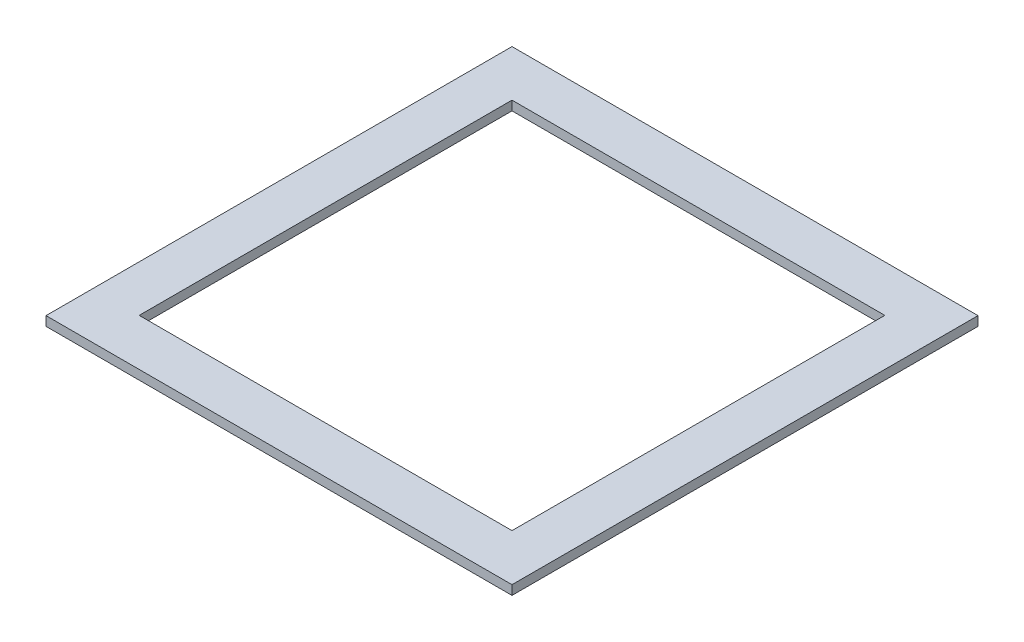
ISO-10303-21;
HEADER;
FILE_DESCRIPTION(('STEP AP214'),'2;1');
FILE_NAME('part.step','',(''),(''),'','','');
FILE_SCHEMA(('AUTOMOTIVE_DESIGN { 1 0 10303 214 1 1 1 1 }'));
ENDSEC;
DATA;
#1=APPLICATION_CONTEXT('core data for automotive mechanical design processes');
#2=APPLICATION_PROTOCOL_DEFINITION('international standard','automotive_design',2000,#1);
#3=PRODUCT_CONTEXT('',#1,'mechanical');
#4=PRODUCT('Part','Part','',(#3));
#5=PRODUCT_RELATED_PRODUCT_CATEGORY('part','',(#4));
#6=PRODUCT_DEFINITION_FORMATION('','',#4);
#7=PRODUCT_DEFINITION_CONTEXT('part definition',#1,'design');
#8=PRODUCT_DEFINITION('design','',#6,#7);
#9=PRODUCT_DEFINITION_SHAPE('','',#8);
#10=(LENGTH_UNIT() NAMED_UNIT(*) SI_UNIT(.MILLI.,.METRE.));
#11=(NAMED_UNIT(*) PLANE_ANGLE_UNIT() SI_UNIT($,.RADIAN.));
#12=(NAMED_UNIT(*) SI_UNIT($,.STERADIAN.) SOLID_ANGLE_UNIT());
#13=UNCERTAINTY_MEASURE_WITH_UNIT(LENGTH_MEASURE(1.E-05),#10,'distance_accuracy_value','');
#14=(GEOMETRIC_REPRESENTATION_CONTEXT(3) GLOBAL_UNCERTAINTY_ASSIGNED_CONTEXT((#13)) GLOBAL_UNIT_ASSIGNED_CONTEXT((#10,
#11,#12)) REPRESENTATION_CONTEXT('',''));
#15=CARTESIAN_POINT('',(0.,0.,0.));
#16=DIRECTION('',(0.,0.,1.));
#17=DIRECTION('',(1.,0.,0.));
#18=AXIS2_PLACEMENT_3D('',#15,#16,#17);
#19=CARTESIAN_POINT('',(0.,2.,0.));
#20=DIRECTION('',(0.,0.,-1.));
#21=DIRECTION('',(-1.,0.,0.));
#22=AXIS2_PLACEMENT_3D('',#19,#20,#21);
#23=PLANE('',#22);
#24=DIRECTION('',(1.,0.,0.));
#25=VECTOR('',#24,1.);
#26=CARTESIAN_POINT('',(0.,0.,0.));
#27=LINE('',#26,#25);
#28=CARTESIAN_POINT('',(0.,0.,0.));
#29=VERTEX_POINT('',#28);
#30=CARTESIAN_POINT('',(100.,0.,0.));
#31=VERTEX_POINT('',#30);
#32=EDGE_CURVE('E143',#29,#31,#27,.T.);
#33=ORIENTED_EDGE('',*,*,#32,.T.);
#34=DIRECTION('',(0.,-1.,0.));
#35=VECTOR('',#34,1.);
#36=CARTESIAN_POINT('',(100.,2.,0.));
#37=LINE('',#36,#35);
#38=CARTESIAN_POINT('',(100.,2.,0.));
#39=VERTEX_POINT('',#38);
#40=EDGE_CURVE('E11',#39,#31,#37,.T.);
#41=ORIENTED_EDGE('',*,*,#40,.F.);
#42=DIRECTION('',(1.,0.,0.));
#43=VECTOR('',#42,1.);
#44=CARTESIAN_POINT('',(0.,2.,0.));
#45=LINE('',#44,#43);
#46=CARTESIAN_POINT('',(0.,2.,0.));
#47=VERTEX_POINT('',#46);
#48=EDGE_CURVE('E114',#47,#39,#45,.T.);
#49=ORIENTED_EDGE('',*,*,#48,.F.);
#50=DIRECTION('',(0.,-1.,0.));
#51=VECTOR('',#50,1.);
#52=CARTESIAN_POINT('',(0.,2.,0.));
#53=LINE('',#52,#51);
#54=EDGE_CURVE('E54',#47,#29,#53,.T.);
#55=ORIENTED_EDGE('',*,*,#54,.T.);
#56=EDGE_LOOP('',(#33,#41,#49,#55));
#57=FACE_BOUND('',#56,.T.);
#58=ADVANCED_FACE('F35',(#57),#23,.F.);
#59=CARTESIAN_POINT('',(100.,2.,0.));
#60=DIRECTION('',(-1.,0.,0.));
#61=DIRECTION('',(0.,0.,1.));
#62=AXIS2_PLACEMENT_3D('',#59,#60,#61);
#63=PLANE('',#62);
#64=DIRECTION('',(0.,0.,-1.));
#65=VECTOR('',#64,1.);
#66=CARTESIAN_POINT('',(100.,0.,0.));
#67=LINE('',#66,#65);
#68=CARTESIAN_POINT('',(100.,0.,-100.));
#69=VERTEX_POINT('',#68);
#70=EDGE_CURVE('E120',#31,#69,#67,.T.);
#71=ORIENTED_EDGE('',*,*,#70,.T.);
#72=DIRECTION('',(0.,-1.,0.));
#73=VECTOR('',#72,1.);
#74=CARTESIAN_POINT('',(100.,2.,-100.));
#75=LINE('',#74,#73);
#76=CARTESIAN_POINT('',(100.,2.,-100.));
#77=VERTEX_POINT('',#76);
#78=EDGE_CURVE('E45',#77,#69,#75,.T.);
#79=ORIENTED_EDGE('',*,*,#78,.F.);
#80=DIRECTION('',(0.,0.,-1.));
#81=VECTOR('',#80,1.);
#82=CARTESIAN_POINT('',(100.,2.,0.));
#83=LINE('',#82,#81);
#84=EDGE_CURVE('E108',#39,#77,#83,.T.);
#85=ORIENTED_EDGE('',*,*,#84,.F.);
#86=ORIENTED_EDGE('',*,*,#40,.T.);
#87=EDGE_LOOP('',(#71,#79,#85,#86));
#88=FACE_BOUND('',#87,.T.);
#89=ADVANCED_FACE('F119',(#88),#63,.F.);
#90=CARTESIAN_POINT('',(0.,2.,-100.));
#91=DIRECTION('',(0.,0.,-1.));
#92=DIRECTION('',(-1.,0.,0.));
#93=AXIS2_PLACEMENT_3D('',#90,#91,#92);
#94=PLANE('',#93);
#95=DIRECTION('',(1.,0.,0.));
#96=VECTOR('',#95,1.);
#97=CARTESIAN_POINT('',(0.,0.,-100.));
#98=LINE('',#97,#96);
#99=CARTESIAN_POINT('',(0.,0.,-100.));
#100=VERTEX_POINT('',#99);
#101=EDGE_CURVE('E146',#100,#69,#98,.T.);
#102=ORIENTED_EDGE('',*,*,#101,.F.);
#103=DIRECTION('',(0.,-1.,0.));
#104=VECTOR('',#103,1.);
#105=CARTESIAN_POINT('',(0.,2.,-100.));
#106=LINE('',#105,#104);
#107=CARTESIAN_POINT('',(0.,2.,-100.));
#108=VERTEX_POINT('',#107);
#109=EDGE_CURVE('E80',#108,#100,#106,.T.);
#110=ORIENTED_EDGE('',*,*,#109,.F.);
#111=DIRECTION('',(1.,0.,0.));
#112=VECTOR('',#111,1.);
#113=CARTESIAN_POINT('',(0.,2.,-100.));
#114=LINE('',#113,#112);
#115=EDGE_CURVE('E113',#108,#77,#114,.T.);
#116=ORIENTED_EDGE('',*,*,#115,.T.);
#117=ORIENTED_EDGE('',*,*,#78,.T.);
#118=EDGE_LOOP('',(#102,#110,#116,#117));
#119=FACE_BOUND('',#118,.T.);
#120=ADVANCED_FACE('F124',(#119),#94,.T.);
#121=CARTESIAN_POINT('',(0.,2.,-90.0468668693287));
#122=DIRECTION('',(0.,0.,1.));
#123=DIRECTION('',(1.,0.,0.));
#124=AXIS2_PLACEMENT_3D('',#121,#122,#123);
#125=PLANE('',#124);
#126=DIRECTION('',(-1.,0.,0.));
#127=VECTOR('',#126,1.);
#128=CARTESIAN_POINT('',(0.,0.,-90.0468668693287));
#129=LINE('',#128,#127);
#130=CARTESIAN_POINT('',(89.9531331306713,0.,-90.0468668693287));
#131=VERTEX_POINT('',#130);
#132=CARTESIAN_POINT('',(9.95313313067135,0.,-90.0468668693287));
#133=VERTEX_POINT('',#132);
#134=EDGE_CURVE('E131',#131,#133,#129,.T.);
#135=ORIENTED_EDGE('',*,*,#134,.F.);
#136=DIRECTION('',(0.,-1.,0.));
#137=VECTOR('',#136,1.);
#138=CARTESIAN_POINT('',(89.9531331306713,2.,-90.0468668693287));
#139=LINE('',#138,#137);
#140=CARTESIAN_POINT('',(89.9531331306713,2.,-90.0468668693287));
#141=VERTEX_POINT('',#140);
#142=EDGE_CURVE('E39',#141,#131,#139,.T.);
#143=ORIENTED_EDGE('',*,*,#142,.F.);
#144=DIRECTION('',(-1.,0.,0.));
#145=VECTOR('',#144,1.);
#146=CARTESIAN_POINT('',(0.,2.,-90.0468668693287));
#147=LINE('',#146,#145);
#148=CARTESIAN_POINT('',(9.95313313067135,2.,-90.0468668693287));
#149=VERTEX_POINT('',#148);
#150=EDGE_CURVE('E151',#141,#149,#147,.T.);
#151=ORIENTED_EDGE('',*,*,#150,.T.);
#152=DIRECTION('',(0.,-1.,0.));
#153=VECTOR('',#152,1.);
#154=CARTESIAN_POINT('',(9.95313313067135,2.,-90.0468668693287));
#155=LINE('',#154,#153);
#156=EDGE_CURVE('E127',#149,#133,#155,.T.);
#157=ORIENTED_EDGE('',*,*,#156,.T.);
#158=EDGE_LOOP('',(#135,#143,#151,#157));
#159=FACE_BOUND('',#158,.T.);
#160=ADVANCED_FACE('F37',(#159),#125,.T.);
#161=CARTESIAN_POINT('',(89.9531331306713,2.,0.));
#162=DIRECTION('',(-1.,0.,0.));
#163=DIRECTION('',(0.,0.,1.));
#164=AXIS2_PLACEMENT_3D('',#161,#162,#163);
#165=PLANE('',#164);
#166=DIRECTION('',(0.,0.,-1.));
#167=VECTOR('',#166,1.);
#168=CARTESIAN_POINT('',(89.9531331306713,0.,0.));
#169=LINE('',#168,#167);
#170=CARTESIAN_POINT('',(89.9531331306713,0.,-10.0468668693287));
#171=VERTEX_POINT('',#170);
#172=EDGE_CURVE('E134',#171,#131,#169,.T.);
#173=ORIENTED_EDGE('',*,*,#172,.F.);
#174=DIRECTION('',(0.,-1.,0.));
#175=VECTOR('',#174,1.);
#176=CARTESIAN_POINT('',(89.9531331306713,2.,-10.0468668693287));
#177=LINE('',#176,#175);
#178=CARTESIAN_POINT('',(89.9531331306713,2.,-10.0468668693287));
#179=VERTEX_POINT('',#178);
#180=EDGE_CURVE('E156',#179,#171,#177,.T.);
#181=ORIENTED_EDGE('',*,*,#180,.F.);
#182=DIRECTION('',(0.,0.,-1.));
#183=VECTOR('',#182,1.);
#184=CARTESIAN_POINT('',(89.9531331306713,2.,0.));
#185=LINE('',#184,#183);
#186=EDGE_CURVE('E165',#179,#141,#185,.T.);
#187=ORIENTED_EDGE('',*,*,#186,.T.);
#188=ORIENTED_EDGE('',*,*,#142,.T.);
#189=EDGE_LOOP('',(#173,#181,#187,#188));
#190=FACE_BOUND('',#189,.T.);
#191=ADVANCED_FACE('F163',(#190),#165,.T.);
#192=CARTESIAN_POINT('',(0.,2.,-10.0468668693287));
#193=DIRECTION('',(0.,0.,-1.));
#194=DIRECTION('',(-1.,0.,0.));
#195=AXIS2_PLACEMENT_3D('',#192,#193,#194);
#196=PLANE('',#195);
#197=DIRECTION('',(1.,0.,0.));
#198=VECTOR('',#197,1.);
#199=CARTESIAN_POINT('',(0.,0.,-10.0468668693287));
#200=LINE('',#199,#198);
#201=CARTESIAN_POINT('',(9.95313313067136,0.,-10.0468668693287));
#202=VERTEX_POINT('',#201);
#203=EDGE_CURVE('E137',#202,#171,#200,.T.);
#204=ORIENTED_EDGE('',*,*,#203,.F.);
#205=DIRECTION('',(0.,-1.,0.));
#206=VECTOR('',#205,1.);
#207=CARTESIAN_POINT('',(9.95313313067136,2.,-10.0468668693287));
#208=LINE('',#207,#206);
#209=CARTESIAN_POINT('',(9.95313313067136,2.,-10.0468668693287));
#210=VERTEX_POINT('',#209);
#211=EDGE_CURVE('E155',#210,#202,#208,.T.);
#212=ORIENTED_EDGE('',*,*,#211,.F.);
#213=DIRECTION('',(1.,0.,0.));
#214=VECTOR('',#213,1.);
#215=CARTESIAN_POINT('',(0.,2.,-10.0468668693287));
#216=LINE('',#215,#214);
#217=EDGE_CURVE('E172',#210,#179,#216,.T.);
#218=ORIENTED_EDGE('',*,*,#217,.T.);
#219=ORIENTED_EDGE('',*,*,#180,.T.);
#220=EDGE_LOOP('',(#204,#212,#218,#219));
#221=FACE_BOUND('',#220,.T.);
#222=ADVANCED_FACE('F170',(#221),#196,.T.);
#223=CARTESIAN_POINT('',(9.95313313067136,2.,0.));
#224=DIRECTION('',(1.,0.,0.));
#225=DIRECTION('',(0.,0.,-1.));
#226=AXIS2_PLACEMENT_3D('',#223,#224,#225);
#227=PLANE('',#226);
#228=DIRECTION('',(0.,0.,1.));
#229=VECTOR('',#228,1.);
#230=CARTESIAN_POINT('',(9.95313313067136,0.,0.));
#231=LINE('',#230,#229);
#232=EDGE_CURVE('E140',#133,#202,#231,.T.);
#233=ORIENTED_EDGE('',*,*,#232,.F.);
#234=ORIENTED_EDGE('',*,*,#156,.F.);
#235=DIRECTION('',(0.,0.,1.));
#236=VECTOR('',#235,1.);
#237=CARTESIAN_POINT('',(9.95313313067136,2.,0.));
#238=LINE('',#237,#236);
#239=EDGE_CURVE('E177',#149,#210,#238,.T.);
#240=ORIENTED_EDGE('',*,*,#239,.T.);
#241=ORIENTED_EDGE('',*,*,#211,.T.);
#242=EDGE_LOOP('',(#233,#234,#240,#241));
#243=FACE_BOUND('',#242,.T.);
#244=ADVANCED_FACE('F179',(#243),#227,.T.);
#245=CARTESIAN_POINT('',(0.,2.,0.));
#246=DIRECTION('',(-1.,0.,0.));
#247=DIRECTION('',(0.,0.,1.));
#248=AXIS2_PLACEMENT_3D('',#245,#246,#247);
#249=PLANE('',#248);
#250=DIRECTION('',(0.,0.,-1.));
#251=VECTOR('',#250,1.);
#252=CARTESIAN_POINT('',(0.,0.,0.));
#253=LINE('',#252,#251);
#254=EDGE_CURVE('E148',#29,#100,#253,.T.);
#255=ORIENTED_EDGE('',*,*,#254,.F.);
#256=ORIENTED_EDGE('',*,*,#54,.F.);
#257=DIRECTION('',(0.,0.,-1.));
#258=VECTOR('',#257,1.);
#259=CARTESIAN_POINT('',(0.,2.,0.));
#260=LINE('',#259,#258);
#261=EDGE_CURVE('E125',#47,#108,#260,.T.);
#262=ORIENTED_EDGE('',*,*,#261,.T.);
#263=ORIENTED_EDGE('',*,*,#109,.T.);
#264=EDGE_LOOP('',(#255,#256,#262,#263));
#265=FACE_BOUND('',#264,.T.);
#266=ADVANCED_FACE('F184',(#265),#249,.T.);
#267=CARTESIAN_POINT('',(0.,2.,0.));
#268=DIRECTION('',(0.,1.,0.));
#269=DIRECTION('',(0.,0.,1.));
#270=AXIS2_PLACEMENT_3D('',#267,#268,#269);
#271=PLANE('',#270);
#272=ORIENTED_EDGE('',*,*,#150,.F.);
#273=ORIENTED_EDGE('',*,*,#186,.F.);
#274=ORIENTED_EDGE('',*,*,#217,.F.);
#275=ORIENTED_EDGE('',*,*,#239,.F.);
#276=EDGE_LOOP('',(#272,#273,#274,#275));
#277=FACE_BOUND('',#276,.T.);
#278=ORIENTED_EDGE('',*,*,#48,.T.);
#279=ORIENTED_EDGE('',*,*,#84,.T.);
#280=ORIENTED_EDGE('',*,*,#115,.F.);
#281=ORIENTED_EDGE('',*,*,#261,.F.);
#282=EDGE_LOOP('',(#278,#279,#280,#281));
#283=FACE_BOUND('',#282,.T.);
#284=ADVANCED_FACE('F110',(#277,#283),#271,.T.);
#285=CARTESIAN_POINT('',(0.,0.,0.));
#286=DIRECTION('',(0.,1.,0.));
#287=DIRECTION('',(0.,0.,1.));
#288=AXIS2_PLACEMENT_3D('',#285,#286,#287);
#289=PLANE('',#288);
#290=ORIENTED_EDGE('',*,*,#134,.T.);
#291=ORIENTED_EDGE('',*,*,#232,.T.);
#292=ORIENTED_EDGE('',*,*,#203,.T.);
#293=ORIENTED_EDGE('',*,*,#172,.T.);
#294=EDGE_LOOP('',(#290,#291,#292,#293));
#295=FACE_BOUND('',#294,.T.);
#296=ORIENTED_EDGE('',*,*,#32,.F.);
#297=ORIENTED_EDGE('',*,*,#254,.T.);
#298=ORIENTED_EDGE('',*,*,#101,.T.);
#299=ORIENTED_EDGE('',*,*,#70,.F.);
#300=EDGE_LOOP('',(#296,#297,#298,#299));
#301=FACE_BOUND('',#300,.T.);
#302=ADVANCED_FACE('F168',(#295,#301),#289,.F.);
#303=CLOSED_SHELL('',(#58,#89,#120,#160,#191,#222,#244,#266,#284,#302));
#304=MANIFOLD_SOLID_BREP('B2',#303);
#305=ADVANCED_BREP_SHAPE_REPRESENTATION('',(#18,#304),#14);
#306=SHAPE_DEFINITION_REPRESENTATION(#9,#305);
ENDSEC;
END-ISO-10303-21;
